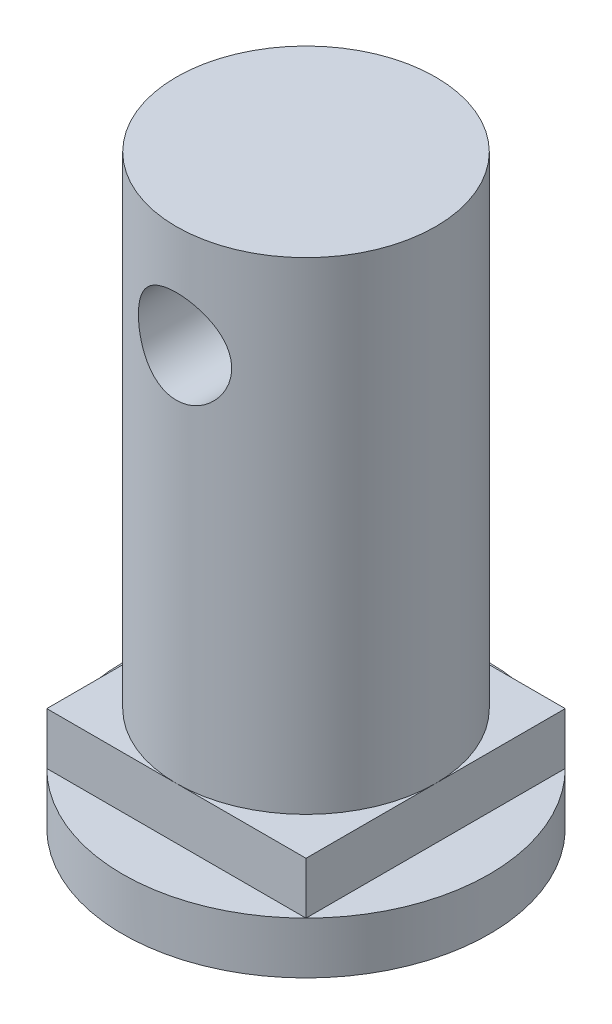
ISO-10303-21;
HEADER;
FILE_DESCRIPTION(('STEP AP214'),'2;1');
FILE_NAME('part.step','',(''),(''),'','','');
FILE_SCHEMA(('AUTOMOTIVE_DESIGN { 1 0 10303 214 1 1 1 1 }'));
ENDSEC;
DATA;
#1=APPLICATION_CONTEXT('core data for automotive mechanical design processes');
#2=APPLICATION_PROTOCOL_DEFINITION('international standard','automotive_design',2000,#1);
#3=PRODUCT_CONTEXT('',#1,'mechanical');
#4=PRODUCT('Part','Part','',(#3));
#5=PRODUCT_RELATED_PRODUCT_CATEGORY('part','',(#4));
#6=PRODUCT_DEFINITION_FORMATION('','',#4);
#7=PRODUCT_DEFINITION_CONTEXT('part definition',#1,'design');
#8=PRODUCT_DEFINITION('design','',#6,#7);
#9=PRODUCT_DEFINITION_SHAPE('','',#8);
#10=(LENGTH_UNIT() NAMED_UNIT(*) SI_UNIT(.MILLI.,.METRE.));
#11=(NAMED_UNIT(*) PLANE_ANGLE_UNIT() SI_UNIT($,.RADIAN.));
#12=(NAMED_UNIT(*) SI_UNIT($,.STERADIAN.) SOLID_ANGLE_UNIT());
#13=UNCERTAINTY_MEASURE_WITH_UNIT(LENGTH_MEASURE(1.E-05),#10,'distance_accuracy_value','');
#14=(GEOMETRIC_REPRESENTATION_CONTEXT(3) GLOBAL_UNCERTAINTY_ASSIGNED_CONTEXT((#13)) GLOBAL_UNIT_ASSIGNED_CONTEXT((#10,
#11,#12)) REPRESENTATION_CONTEXT('',''));
#15=CARTESIAN_POINT('',(0.,0.,0.));
#16=DIRECTION('',(0.,0.,1.));
#17=DIRECTION('',(1.,0.,0.));
#18=AXIS2_PLACEMENT_3D('',#15,#16,#17);
#19=CARTESIAN_POINT('',(0.,1.,0.));
#20=DIRECTION('',(0.,-1.,0.));
#21=DIRECTION('',(0.,0.,-1.));
#22=AXIS2_PLACEMENT_3D('',#19,#20,#21);
#23=PLANE('',#22);
#24=CARTESIAN_POINT('',(2.5,1.,-2.5));
#25=DIRECTION('',(0.,1.,0.));
#26=DIRECTION('',(0.,0.,1.));
#27=AXIS2_PLACEMENT_3D('',#24,#25,#26);
#28=CIRCLE('',#27,2.5);
#29=CARTESIAN_POINT('',(2.5,1.,0.));
#30=VERTEX_POINT('',#29);
#31=CARTESIAN_POINT('',(5.,1.,-2.5));
#32=VERTEX_POINT('',#31);
#33=EDGE_CURVE('E57',#30,#32,#28,.T.);
#34=ORIENTED_EDGE('',*,*,#33,.F.);
#35=DIRECTION('',(1.,0.,0.));
#36=VECTOR('',#35,1.);
#37=CARTESIAN_POINT('',(0.,1.,0.));
#38=LINE('',#37,#36);
#39=CARTESIAN_POINT('',(5.,1.,0.));
#40=VERTEX_POINT('',#39);
#41=EDGE_CURVE('E112',#30,#40,#38,.T.);
#42=ORIENTED_EDGE('',*,*,#41,.T.);
#43=DIRECTION('',(0.,0.,-1.));
#44=VECTOR('',#43,1.);
#45=CARTESIAN_POINT('',(5.,1.,0.));
#46=LINE('',#45,#44);
#47=EDGE_CURVE('E126',#40,#32,#46,.T.);
#48=ORIENTED_EDGE('',*,*,#47,.T.);
#49=EDGE_LOOP('',(#34,#42,#48));
#50=FACE_BOUND('',#49,.T.);
#51=ADVANCED_FACE('F45',(#50),#23,.F.);
#52=CARTESIAN_POINT('',(2.5,1.,-5.));
#53=VERTEX_POINT('',#52);
#54=EDGE_CURVE('E11',#32,#53,#28,.T.);
#55=ORIENTED_EDGE('',*,*,#54,.F.);
#56=CARTESIAN_POINT('',(5.,1.,-5.));
#57=VERTEX_POINT('',#56);
#58=EDGE_CURVE('E111',#32,#57,#46,.T.);
#59=ORIENTED_EDGE('',*,*,#58,.T.);
#60=DIRECTION('',(-1.,0.,0.));
#61=VECTOR('',#60,1.);
#62=CARTESIAN_POINT('',(0.,1.,-5.));
#63=LINE('',#62,#61);
#64=EDGE_CURVE('E154',#57,#53,#63,.T.);
#65=ORIENTED_EDGE('',*,*,#64,.T.);
#66=EDGE_LOOP('',(#55,#59,#65));
#67=FACE_BOUND('',#66,.T.);
#68=ADVANCED_FACE('F242',(#67),#23,.F.);
#69=CARTESIAN_POINT('',(0.,1.,-2.5));
#70=VERTEX_POINT('',#69);
#71=EDGE_CURVE('E55',#53,#70,#28,.T.);
#72=ORIENTED_EDGE('',*,*,#71,.F.);
#73=CARTESIAN_POINT('',(0.,1.,-5.));
#74=VERTEX_POINT('',#73);
#75=EDGE_CURVE('E153',#53,#74,#63,.T.);
#76=ORIENTED_EDGE('',*,*,#75,.T.);
#77=DIRECTION('',(0.,0.,1.));
#78=VECTOR('',#77,1.);
#79=CARTESIAN_POINT('',(0.,1.,0.));
#80=LINE('',#79,#78);
#81=EDGE_CURVE('E124',#74,#70,#80,.T.);
#82=ORIENTED_EDGE('',*,*,#81,.T.);
#83=EDGE_LOOP('',(#72,#76,#82));
#84=FACE_BOUND('',#83,.T.);
#85=ADVANCED_FACE('F232',(#84),#23,.F.);
#86=CARTESIAN_POINT('',(0.,1.,0.));
#87=DIRECTION('',(1.,0.,0.));
#88=DIRECTION('',(0.,0.,-1.));
#89=AXIS2_PLACEMENT_3D('',#86,#87,#88);
#90=PLANE('',#89);
#91=DIRECTION('',(0.,0.,1.));
#92=VECTOR('',#91,1.);
#93=CARTESIAN_POINT('',(0.,0.,0.));
#94=LINE('',#93,#92);
#95=CARTESIAN_POINT('',(0.,0.,-5.));
#96=VERTEX_POINT('',#95);
#97=CARTESIAN_POINT('',(0.,0.,0.));
#98=VERTEX_POINT('',#97);
#99=EDGE_CURVE('E143',#96,#98,#94,.T.);
#100=ORIENTED_EDGE('',*,*,#99,.T.);
#101=DIRECTION('',(0.,-1.,0.));
#102=VECTOR('',#101,1.);
#103=CARTESIAN_POINT('',(0.,1.,0.));
#104=LINE('',#103,#102);
#105=CARTESIAN_POINT('',(0.,1.,0.));
#106=VERTEX_POINT('',#105);
#107=EDGE_CURVE('E49',#106,#98,#104,.T.);
#108=ORIENTED_EDGE('',*,*,#107,.F.);
#109=EDGE_CURVE('E106',#70,#106,#80,.T.);
#110=ORIENTED_EDGE('',*,*,#109,.F.);
#111=ORIENTED_EDGE('',*,*,#81,.F.);
#112=DIRECTION('',(0.,-1.,0.));
#113=VECTOR('',#112,1.);
#114=CARTESIAN_POINT('',(0.,1.,-5.));
#115=LINE('',#114,#113);
#116=EDGE_CURVE('E157',#74,#96,#115,.T.);
#117=ORIENTED_EDGE('',*,*,#116,.T.);
#118=EDGE_LOOP('',(#100,#108,#110,#111,#117));
#119=FACE_BOUND('',#118,.T.);
#120=ADVANCED_FACE('F47',(#119),#90,.F.);
#121=CARTESIAN_POINT('',(0.,1.,0.));
#122=DIRECTION('',(0.,0.,-1.));
#123=DIRECTION('',(-1.,0.,0.));
#124=AXIS2_PLACEMENT_3D('',#121,#122,#123);
#125=PLANE('',#124);
#126=DIRECTION('',(1.,0.,0.));
#127=VECTOR('',#126,1.);
#128=CARTESIAN_POINT('',(0.,0.,0.));
#129=LINE('',#128,#127);
#130=CARTESIAN_POINT('',(5.,0.,0.));
#131=VERTEX_POINT('',#130);
#132=EDGE_CURVE('E161',#98,#131,#129,.T.);
#133=ORIENTED_EDGE('',*,*,#132,.T.);
#134=DIRECTION('',(0.,-1.,0.));
#135=VECTOR('',#134,1.);
#136=CARTESIAN_POINT('',(5.,1.,0.));
#137=LINE('',#136,#135);
#138=EDGE_CURVE('E119',#40,#131,#137,.T.);
#139=ORIENTED_EDGE('',*,*,#138,.F.);
#140=ORIENTED_EDGE('',*,*,#41,.F.);
#141=EDGE_CURVE('E100',#106,#30,#38,.T.);
#142=ORIENTED_EDGE('',*,*,#141,.F.);
#143=ORIENTED_EDGE('',*,*,#107,.T.);
#144=EDGE_LOOP('',(#133,#139,#140,#142,#143));
#145=FACE_BOUND('',#144,.T.);
#146=ADVANCED_FACE('F117',(#145),#125,.F.);
#147=CARTESIAN_POINT('',(5.,1.,0.));
#148=DIRECTION('',(-1.,0.,0.));
#149=DIRECTION('',(0.,0.,1.));
#150=AXIS2_PLACEMENT_3D('',#147,#148,#149);
#151=PLANE('',#150);
#152=DIRECTION('',(0.,0.,-1.));
#153=VECTOR('',#152,1.);
#154=CARTESIAN_POINT('',(5.,0.,0.));
#155=LINE('',#154,#153);
#156=CARTESIAN_POINT('',(5.,0.,-5.));
#157=VERTEX_POINT('',#156);
#158=EDGE_CURVE('E164',#131,#157,#155,.T.);
#159=ORIENTED_EDGE('',*,*,#158,.T.);
#160=DIRECTION('',(0.,-1.,0.));
#161=VECTOR('',#160,1.);
#162=CARTESIAN_POINT('',(5.,1.,-5.));
#163=LINE('',#162,#161);
#164=EDGE_CURVE('E175',#57,#157,#163,.T.);
#165=ORIENTED_EDGE('',*,*,#164,.F.);
#166=ORIENTED_EDGE('',*,*,#58,.F.);
#167=ORIENTED_EDGE('',*,*,#47,.F.);
#168=ORIENTED_EDGE('',*,*,#138,.T.);
#169=EDGE_LOOP('',(#159,#165,#166,#167,#168));
#170=FACE_BOUND('',#169,.T.);
#171=ADVANCED_FACE('F179',(#170),#151,.F.);
#172=CARTESIAN_POINT('',(0.,1.,-5.));
#173=DIRECTION('',(0.,0.,1.));
#174=DIRECTION('',(1.,0.,0.));
#175=AXIS2_PLACEMENT_3D('',#172,#173,#174);
#176=PLANE('',#175);
#177=DIRECTION('',(-1.,0.,0.));
#178=VECTOR('',#177,1.);
#179=CARTESIAN_POINT('',(0.,0.,-5.));
#180=LINE('',#179,#178);
#181=EDGE_CURVE('E168',#157,#96,#180,.T.);
#182=ORIENTED_EDGE('',*,*,#181,.T.);
#183=ORIENTED_EDGE('',*,*,#116,.F.);
#184=ORIENTED_EDGE('',*,*,#75,.F.);
#185=ORIENTED_EDGE('',*,*,#64,.F.);
#186=ORIENTED_EDGE('',*,*,#164,.T.);
#187=EDGE_LOOP('',(#182,#183,#184,#185,#186));
#188=FACE_BOUND('',#187,.T.);
#189=ADVANCED_FACE('F231',(#188),#176,.F.);
#190=EDGE_CURVE('E104',#70,#30,#28,.T.);
#191=ORIENTED_EDGE('',*,*,#190,.F.);
#192=ORIENTED_EDGE('',*,*,#109,.T.);
#193=ORIENTED_EDGE('',*,*,#141,.T.);
#194=EDGE_LOOP('',(#191,#192,#193));
#195=FACE_BOUND('',#194,.T.);
#196=ADVANCED_FACE('F102',(#195),#23,.F.);
#197=CARTESIAN_POINT('',(2.5,0.,-2.5));
#198=DIRECTION('',(0.,-1.,0.));
#199=DIRECTION('',(0.,0.,-1.));
#200=AXIS2_PLACEMENT_3D('',#197,#198,#199);
#201=PLANE('',#200);
#202=ORIENTED_EDGE('',*,*,#99,.F.);
#203=CARTESIAN_POINT('',(2.5,0.,-2.5));
#204=DIRECTION('',(0.,-1.,0.));
#205=DIRECTION('',(0.,0.,-1.));
#206=AXIS2_PLACEMENT_3D('',#203,#204,#205);
#207=CIRCLE('',#206,3.53553390593274);
#208=EDGE_CURVE('E345',#98,#96,#207,.T.);
#209=ORIENTED_EDGE('',*,*,#208,.F.);
#210=EDGE_LOOP('',(#202,#209));
#211=FACE_BOUND('',#210,.T.);
#212=ADVANCED_FACE('F220',(#211),#201,.F.);
#213=ORIENTED_EDGE('',*,*,#181,.F.);
#214=EDGE_CURVE('E148',#96,#157,#207,.T.);
#215=ORIENTED_EDGE('',*,*,#214,.F.);
#216=EDGE_LOOP('',(#213,#215));
#217=FACE_BOUND('',#216,.T.);
#218=ADVANCED_FACE('F223',(#217),#201,.F.);
#219=ORIENTED_EDGE('',*,*,#158,.F.);
#220=EDGE_CURVE('E144',#157,#131,#207,.T.);
#221=ORIENTED_EDGE('',*,*,#220,.F.);
#222=EDGE_LOOP('',(#219,#221));
#223=FACE_BOUND('',#222,.T.);
#224=ADVANCED_FACE('F300',(#223),#201,.F.);
#225=ORIENTED_EDGE('',*,*,#132,.F.);
#226=EDGE_CURVE('E147',#131,#98,#207,.T.);
#227=ORIENTED_EDGE('',*,*,#226,.F.);
#228=EDGE_LOOP('',(#225,#227));
#229=FACE_BOUND('',#228,.T.);
#230=ADVANCED_FACE('F225',(#229),#201,.F.);
#231=CARTESIAN_POINT('',(2.5,-1.,-2.5));
#232=DIRECTION('',(0.,1.,0.));
#233=DIRECTION('',(0.,0.,1.));
#234=AXIS2_PLACEMENT_3D('',#231,#232,#233);
#235=CYLINDRICAL_SURFACE('',#234,3.53553390593274);
#236=CARTESIAN_POINT('',(2.5,-1.,-2.5));
#237=DIRECTION('',(0.,-1.,0.));
#238=DIRECTION('',(0.,0.,-1.));
#239=AXIS2_PLACEMENT_3D('',#236,#237,#238);
#240=CIRCLE('',#239,3.53553390593274);
#241=CARTESIAN_POINT('',(2.5,-1.,-6.03553390593274));
#242=VERTEX_POINT('',#241);
#243=EDGE_CURVE('E139',#242,#242,#240,.T.);
#244=ORIENTED_EDGE('',*,*,#243,.F.);
#245=EDGE_LOOP('',(#244));
#246=FACE_BOUND('',#245,.T.);
#247=ORIENTED_EDGE('',*,*,#220,.T.);
#248=ORIENTED_EDGE('',*,*,#226,.T.);
#249=ORIENTED_EDGE('',*,*,#208,.T.);
#250=ORIENTED_EDGE('',*,*,#214,.T.);
#251=EDGE_LOOP('',(#247,#248,#249,#250));
#252=FACE_BOUND('',#251,.T.);
#253=ADVANCED_FACE('F218',(#246,#252),#235,.T.);
#254=CARTESIAN_POINT('',(2.5,-1.,-2.5));
#255=DIRECTION('',(0.,-1.,0.));
#256=DIRECTION('',(0.,0.,-1.));
#257=AXIS2_PLACEMENT_3D('',#254,#255,#256);
#258=PLANE('',#257);
#259=ORIENTED_EDGE('',*,*,#243,.T.);
#260=EDGE_LOOP('',(#259));
#261=FACE_BOUND('',#260,.T.);
#262=ADVANCED_FACE('F214',(#261),#258,.T.);
#263=CARTESIAN_POINT('',(2.5,10.3,-2.5));
#264=DIRECTION('',(0.,-1.,0.));
#265=DIRECTION('',(0.,0.,-1.));
#266=AXIS2_PLACEMENT_3D('',#263,#264,#265);
#267=CYLINDRICAL_SURFACE('',#266,2.5);
#268=CARTESIAN_POINT('',(1.6,8.29999999999999,-4.83238075793812));
#269=CARTESIAN_POINT('',(1.5999988310946,8.34876077261855,-4.83237972255872));
#270=CARTESIAN_POINT('',(1.60397595979654,8.3975135116308,-4.83392649973988));
#271=CARTESIAN_POINT('',(1.61971407383427,8.49355847846579,-4.83990735648669));
#272=CARTESIAN_POINT('',(1.63147534085306,8.54085065337058,-4.84434154053824));
#273=CARTESIAN_POINT('',(1.66230195401386,8.63256375653346,-4.85553123375878));
#274=CARTESIAN_POINT('',(1.68135101404703,8.67699083061935,-4.86228156356725));
#275=CARTESIAN_POINT('',(1.7261554741314,8.76203504239918,-4.87733492032442));
#276=CARTESIAN_POINT('',(1.75191270787681,8.8026511342168,-4.88563837164716));
#277=CARTESIAN_POINT('',(1.81066419873866,8.88077805066752,-4.90328804585983));
#278=CARTESIAN_POINT('',(1.84391476837038,8.91808962801866,-4.91266326645175));
#279=CARTESIAN_POINT('',(1.91616405909194,8.9867457968939,-4.93115707345925));
#280=CARTESIAN_POINT('',(1.95516388418706,9.01808923972732,-4.94027561018351));
#281=CARTESIAN_POINT('',(2.03929635057485,9.07485821370753,-4.95756996869939));
#282=CARTESIAN_POINT('',(2.08458167308578,9.10007007806623,-4.96570778605709));
#283=CARTESIAN_POINT('',(2.17909501593966,9.14243653780125,-4.97977783065992));
#284=CARTESIAN_POINT('',(2.22832177796883,9.15959369275132,-4.98571075843563));
#285=CARTESIAN_POINT('',(2.32722795157567,9.18467357711901,-4.9944968780727));
#286=CARTESIAN_POINT('',(2.37681023466333,9.19293869672343,-4.9974639206395));
#287=CARTESIAN_POINT('',(2.47674086194507,9.20109383356248,-5.000390891219));
#288=CARTESIAN_POINT('',(2.52708897191783,9.20098636195888,-5.00035172087459));
#289=CARTESIAN_POINT('',(2.62467942063577,9.19260540830949,-4.99734487377734));
#290=CARTESIAN_POINT('',(2.67195861486997,9.18470493632491,-4.99451096773935));
#291=CARTESIAN_POINT('',(2.76446879699774,9.16158573657739,-4.98640572646177));
#292=CARTESIAN_POINT('',(2.80969964124737,9.14636649644059,-4.98113422057116));
#293=CARTESIAN_POINT('',(2.8975845014312,9.10885240497586,-4.96858795160326));
#294=CARTESIAN_POINT('',(2.94019313126167,9.08646070894368,-4.96128596151781));
#295=CARTESIAN_POINT('',(3.02115046019317,9.03532064859256,-4.94542561558651));
#296=CARTESIAN_POINT('',(3.05949784295766,9.00657032819492,-4.93686687340382));
#297=CARTESIAN_POINT('',(3.13305081808628,8.94170055370001,-4.9188340861146));
#298=CARTESIAN_POINT('',(3.1679726347311,8.90526566196564,-4.90933557563966));
#299=CARTESIAN_POINT('',(3.23131191430383,8.82698994126879,-4.89087303983219));
#300=CARTESIAN_POINT('',(3.25972799716505,8.78514796823723,-4.88190912820223));
#301=CARTESIAN_POINT('',(3.30973374403535,8.69620934659499,-4.8653838047668));
#302=CARTESIAN_POINT('',(3.33118310191462,8.64902780384452,-4.85785235271216));
#303=CARTESIAN_POINT('',(3.3657286738907,8.55138074727576,-4.84539019167064));
#304=CARTESIAN_POINT('',(3.37882910075839,8.5009169038567,-4.84045817125928));
#305=CARTESIAN_POINT('',(3.39568486162895,8.40092305065069,-4.83405788543153));
#306=CARTESIAN_POINT('',(3.39988714987818,8.35147901933812,-4.83242415952583));
#307=CARTESIAN_POINT('',(3.40010828267304,8.25257602020313,-4.83233911876553));
#308=CARTESIAN_POINT('',(3.39612895029201,8.20311705816301,-4.83388709494669));
#309=CARTESIAN_POINT('',(3.38050383939668,8.10778065171387,-4.83982409955253));
#310=CARTESIAN_POINT('',(3.36919009750261,8.06184025296223,-4.84408994930444));
#311=CARTESIAN_POINT('',(3.33962781249617,7.97252616343864,-4.8548398599736));
#312=CARTESIAN_POINT('',(3.3213779172127,7.92915297503913,-4.86132435338058));
#313=CARTESIAN_POINT('',(3.27772991525145,7.8444954488123,-4.87606465692084));
#314=CARTESIAN_POINT('',(3.25210116704368,7.80333981981316,-4.88437514971294));
#315=CARTESIAN_POINT('',(3.19467413351478,7.72575344722467,-4.90173404552875));
#316=CARTESIAN_POINT('',(3.16287374772465,7.6893243193264,-4.91078269917029));
#317=CARTESIAN_POINT('',(3.09183639463389,7.62005177853221,-4.92922829134542));
#318=CARTESIAN_POINT('',(3.0522766447546,7.58753564535454,-4.93861528058005));
#319=CARTESIAN_POINT('',(2.96803055910256,7.52957082853051,-4.956175134738));
#320=CARTESIAN_POINT('',(2.92334429450827,7.50412204677516,-4.96434801651484));
#321=CARTESIAN_POINT('',(2.83022668939111,7.46121259084982,-4.97853887788453));
#322=CARTESIAN_POINT('',(2.78181474932663,7.44371342914428,-4.98456720869391));
#323=CARTESIAN_POINT('',(2.68247046637583,7.41719507218553,-4.9938300477662));
#324=CARTESIAN_POINT('',(2.63153921388232,7.40817224148666,-4.9970657537201));
#325=CARTESIAN_POINT('',(2.53157259053393,7.39923125632131,-5.00027374444055));
#326=CARTESIAN_POINT('',(2.48258391806748,7.39884649879399,-5.00041327063264));
#327=CARTESIAN_POINT('',(2.38527151462321,7.40601066191544,-4.99784020568471));
#328=CARTESIAN_POINT('',(2.33694771430426,7.41355874877636,-4.99512791428722));
#329=CARTESIAN_POINT('',(2.24336315907649,7.43605214410726,-4.98722714248642));
#330=CARTESIAN_POINT('',(2.19805934102281,7.45083840821812,-4.98209198374571));
#331=CARTESIAN_POINT('',(2.11056622872084,7.48723457844824,-4.9698774626675));
#332=CARTESIAN_POINT('',(2.06837752138439,7.50884576641096,-4.96279773513759));
#333=CARTESIAN_POINT('',(1.98644917626604,7.55927595196162,-4.94705463029599));
#334=CARTESIAN_POINT('',(1.94687726804129,7.58835080540135,-4.93833884114341));
#335=CARTESIAN_POINT('',(1.87302650867719,7.65246822620577,-4.9204030644955));
#336=CARTESIAN_POINT('',(1.83874948800668,7.68751284858444,-4.91118290412151));
#337=CARTESIAN_POINT('',(1.77478774308687,7.76456454065739,-4.89274502411565));
#338=CARTESIAN_POINT('',(1.74539963636384,7.80682378654405,-4.88354835176278));
#339=CARTESIAN_POINT('',(1.69414347551836,7.8959726131574,-4.86671209373524));
#340=CARTESIAN_POINT('',(1.67227510793206,7.94286200076955,-4.85907244316078));
#341=CARTESIAN_POINT('',(1.63663496275692,8.04052215536305,-4.84626654175687));
#342=CARTESIAN_POINT('',(1.62294915462848,8.0913280128433,-4.84112665579182));
#343=CARTESIAN_POINT('',(1.60463467943077,8.19475967783668,-4.83418519806388));
#344=CARTESIAN_POINT('',(1.60000126131151,8.24738451590933,-4.83238187516793));
#345=CARTESIAN_POINT('',(1.6,8.29999999999999,-4.83238075793812));
#346=B_SPLINE_CURVE_WITH_KNOTS('',3,(#268,#269,#270,#271,#272,#273,#274,#275,#276,#277,#278,
#279,#280,#281,#282,#283,#284,#285,#286,#287,#288,#289,#290,#291,#292,#293,#294,#295,#296,#297,
#298,#299,#300,#301,#302,#303,#304,#305,#306,#307,#308,#309,#310,#311,#312,#313,#314,#315,#316,
#317,#318,#319,#320,#321,#322,#323,#324,#325,#326,#327,#328,#329,#330,#331,#332,#333,#334,#335,
#336,#337,#338,#339,#340,#341,#342,#343,#344,#345),.UNSPECIFIED.,.T.,.F.,(4,2,2,2,2,2,2,2,2,2,2,
2,2,2,2,2,2,2,2,2,2,2,2,2,2,2,2,2,2,2,2,2,2,2,2,2,2,2,4),(0.,0.146086790422655,
0.292178867546775,0.437946360320959,0.583753740861977,0.735621751211313,0.887518962213253,
1.04412673491154,1.20068470805653,1.35097110894591,1.50121243513853,1.64459510288818,
1.78798781006364,1.93340460520995,2.07886619673078,2.23222853504487,2.38562337615772,
2.54193943054282,2.69817654713301,2.84635909673995,2.9945086310812,3.136379856629,
3.2782787535153,3.42521213872044,3.57219561953956,3.72764307152483,3.88308836548029,
4.03777284455019,4.19239095007947,4.33863569017373,4.48486506063665,4.62801652521723,
4.7711948922236,4.92015591571603,5.06916832107719,5.22528055804461,5.38138628661105,
5.53910455331926,5.69674002102334),.UNSPECIFIED.);
#347=CARTESIAN_POINT('',(1.6,8.29999999999999,-4.83238075793812));
#348=VERTEX_POINT('',#347);
#349=EDGE_CURVE('E186',#348,#348,#346,.T.);
#350=ORIENTED_EDGE('',*,*,#349,.F.);
#351=EDGE_LOOP('',(#350));
#352=FACE_BOUND('',#351,.T.);
#353=CARTESIAN_POINT('',(1.6,8.29999999999999,-0.167619242061877));
#354=CARTESIAN_POINT('',(1.5999988310946,8.25123922738143,-0.167620277441282));
#355=CARTESIAN_POINT('',(1.60397595979654,8.20248648836918,-0.166073500260116));
#356=CARTESIAN_POINT('',(1.61971407383427,8.10644152153419,-0.160092643513306));
#357=CARTESIAN_POINT('',(1.63147534085306,8.0591493466294,-0.155658459461761));
#358=CARTESIAN_POINT('',(1.66230195401386,7.96743624346652,-0.144468766241218));
#359=CARTESIAN_POINT('',(1.68135101404703,7.92300916938063,-0.137718436432745));
#360=CARTESIAN_POINT('',(1.7261554741314,7.8379649576008,-0.122665079675584));
#361=CARTESIAN_POINT('',(1.75191270787681,7.79734886578318,-0.114361628352838));
#362=CARTESIAN_POINT('',(1.81066419873866,7.71922194933246,-0.0967119541401698));
#363=CARTESIAN_POINT('',(1.84391476837038,7.68191037198132,-0.08733673354825));
#364=CARTESIAN_POINT('',(1.91616405909194,7.61325420310607,-0.0688429265407449));
#365=CARTESIAN_POINT('',(1.95516388418706,7.58191076027265,-0.0597243898164905));
#366=CARTESIAN_POINT('',(2.03929635057485,7.52514178629245,-0.0424300313006107));
#367=CARTESIAN_POINT('',(2.08458167308578,7.49992992193374,-0.0342922139429125));
#368=CARTESIAN_POINT('',(2.17909501593966,7.45756346219873,-0.0202221693400807));
#369=CARTESIAN_POINT('',(2.22832177796883,7.44040630724865,-0.0142892415643646));
#370=CARTESIAN_POINT('',(2.32722795157567,7.41532642288097,-0.00550312192730348));
#371=CARTESIAN_POINT('',(2.37681023466333,7.40706130327655,-0.00253607936050109));
#372=CARTESIAN_POINT('',(2.47674086194507,7.3989061664375,0.000390891218998416));
#373=CARTESIAN_POINT('',(2.52708897191783,7.3990136380411,0.000351720874587429));
#374=CARTESIAN_POINT('',(2.62467942063577,7.40739459169049,-0.00265512622265858));
#375=CARTESIAN_POINT('',(2.67195861486997,7.41529506367507,-0.00548903226064793));
#376=CARTESIAN_POINT('',(2.76446879699774,7.43841426342258,-0.0135942735382323));
#377=CARTESIAN_POINT('',(2.80969964124737,7.45363350355939,-0.0188657794288406));
#378=CARTESIAN_POINT('',(2.8975845014312,7.49114759502412,-0.031412048396743));
#379=CARTESIAN_POINT('',(2.94019313126167,7.51353929105629,-0.0387140384821908));
#380=CARTESIAN_POINT('',(3.02115046019317,7.56467935140742,-0.0545743844134872));
#381=CARTESIAN_POINT('',(3.05949784295766,7.59342967180506,-0.0631331265961785));
#382=CARTESIAN_POINT('',(3.13305081808628,7.65829944629997,-0.0811659138853987));
#383=CARTESIAN_POINT('',(3.1679726347311,7.69473433803434,-0.0906644243603361));
#384=CARTESIAN_POINT('',(3.23131191430383,7.77301005873119,-0.109126960167812));
#385=CARTESIAN_POINT('',(3.25972799716505,7.81485203176275,-0.118090871797772));
#386=CARTESIAN_POINT('',(3.30973374403535,7.90379065340498,-0.134616195233197));
#387=CARTESIAN_POINT('',(3.33118310191462,7.95097219615546,-0.142147647287835));
#388=CARTESIAN_POINT('',(3.3657286738907,8.04861925272421,-0.154609808329362));
#389=CARTESIAN_POINT('',(3.37882910075839,8.09908309614327,-0.159541828740722));
#390=CARTESIAN_POINT('',(3.39568486162895,8.19907694934928,-0.165942114568465));
#391=CARTESIAN_POINT('',(3.39988714987818,8.24852098066186,-0.167575840474173));
#392=CARTESIAN_POINT('',(3.40010828267304,8.34742397979685,-0.167660881234472));
#393=CARTESIAN_POINT('',(3.39612895029201,8.39688294183697,-0.166112905053306));
#394=CARTESIAN_POINT('',(3.38050383939668,8.49221934828611,-0.16017590044747));
#395=CARTESIAN_POINT('',(3.36919009750261,8.53815974703775,-0.155910050695561));
#396=CARTESIAN_POINT('',(3.33962781249617,8.62747383656134,-0.145160140026402));
#397=CARTESIAN_POINT('',(3.3213779172127,8.67084702496085,-0.138675646619417));
#398=CARTESIAN_POINT('',(3.27772991525145,8.75550455118768,-0.12393534307916));
#399=CARTESIAN_POINT('',(3.25210116704368,8.79666018018682,-0.115624850287064));
#400=CARTESIAN_POINT('',(3.19467413351478,8.8742465527753,-0.0982659544712512));
#401=CARTESIAN_POINT('',(3.16287374772465,8.91067568067357,-0.089217300829707));
#402=CARTESIAN_POINT('',(3.09183639463389,8.97994822146777,-0.0707717086545786));
#403=CARTESIAN_POINT('',(3.0522766447546,9.01246435464543,-0.0613847194199514));
#404=CARTESIAN_POINT('',(2.96803055910257,9.07042917146946,-0.043824865261996));
#405=CARTESIAN_POINT('',(2.92334429450828,9.09587795322482,-0.0356519834851574));
#406=CARTESIAN_POINT('',(2.83022668939111,9.13878740915016,-0.0214611221154698));
#407=CARTESIAN_POINT('',(2.78181474932663,9.1562865708557,-0.01543279130609));
#408=CARTESIAN_POINT('',(2.68247046637583,9.18280492781444,-0.00616995223379688));
#409=CARTESIAN_POINT('',(2.63153921388231,9.19182775851331,-0.00293424627989819));
#410=CARTESIAN_POINT('',(2.53157259053393,9.20076874367866,0.000273744440549313));
#411=CARTESIAN_POINT('',(2.48258391806748,9.20115350120598,0.000413270632638444));
#412=CARTESIAN_POINT('',(2.38527151462321,9.19398933808453,-0.00215979431528546));
#413=CARTESIAN_POINT('',(2.33694771430426,9.18644125122362,-0.00487208571278092));
#414=CARTESIAN_POINT('',(2.24336315907649,9.16394785589272,-0.0127728575135761));
#415=CARTESIAN_POINT('',(2.19805934102281,9.14916159178185,-0.0179080162542938));
#416=CARTESIAN_POINT('',(2.11056622872084,9.11276542155173,-0.0301225373324973));
#417=CARTESIAN_POINT('',(2.06837752138439,9.09115423358902,-0.0372022648624104));
#418=CARTESIAN_POINT('',(1.98644917626604,9.04072404803836,-0.052945369704009));
#419=CARTESIAN_POINT('',(1.94687726804129,9.01164919459862,-0.0616611588565855));
#420=CARTESIAN_POINT('',(1.87302650867719,8.94753177379421,-0.0795969355045019));
#421=CARTESIAN_POINT('',(1.83874948800668,8.91248715141553,-0.0888170958784849));
#422=CARTESIAN_POINT('',(1.77478774308687,8.83543545934258,-0.107254975884353));
#423=CARTESIAN_POINT('',(1.74539963636384,8.79317621345592,-0.116451648237217));
#424=CARTESIAN_POINT('',(1.69414347551836,8.70402738684258,-0.13328790626476));
#425=CARTESIAN_POINT('',(1.67227510793206,8.65713799923043,-0.140927556839215));
#426=CARTESIAN_POINT('',(1.63663496275692,8.55947784463692,-0.153733458243132));
#427=CARTESIAN_POINT('',(1.62294915462848,8.50867198715667,-0.158873344208182));
#428=CARTESIAN_POINT('',(1.60463467943077,8.4052403221633,-0.165814801936119));
#429=CARTESIAN_POINT('',(1.60000126131151,8.35261548409065,-0.16761812483207));
#430=CARTESIAN_POINT('',(1.6,8.29999999999999,-0.167619242061877));
#431=B_SPLINE_CURVE_WITH_KNOTS('',3,(#353,#354,#355,#356,#357,#358,#359,#360,#361,#362,#363,
#364,#365,#366,#367,#368,#369,#370,#371,#372,#373,#374,#375,#376,#377,#378,#379,#380,#381,#382,
#383,#384,#385,#386,#387,#388,#389,#390,#391,#392,#393,#394,#395,#396,#397,#398,#399,#400,#401,
#402,#403,#404,#405,#406,#407,#408,#409,#410,#411,#412,#413,#414,#415,#416,#417,#418,#419,#420,
#421,#422,#423,#424,#425,#426,#427,#428,#429,#430),.UNSPECIFIED.,.T.,.F.,(4,2,2,2,2,2,2,2,2,2,2,
2,2,2,2,2,2,2,2,2,2,2,2,2,2,2,2,2,2,2,2,2,2,2,2,2,2,2,4),(0.,0.146086790422655,
0.292178867546775,0.437946360320958,0.583753740861976,0.735621751211314,0.887518962213254,
1.04412673491154,1.20068470805653,1.35097110894591,1.50121243513853,1.64459510288818,
1.78798781006364,1.93340460520995,2.07886619673078,2.23222853504487,2.38562337615772,
2.54193943054282,2.69817654713301,2.84635909673995,2.9945086310812,3.136379856629,
3.2782787535153,3.42521213872044,3.57219561953956,3.72764307152483,3.88308836548029,
4.0377728445502,4.19239095007947,4.33863569017373,4.48486506063665,4.62801652521723,
4.7711948922236,4.92015591571603,5.06916832107719,5.22528055804461,5.38138628661105,
5.53910455331927,5.69674002102334),.UNSPECIFIED.);
#432=CARTESIAN_POINT('',(1.6,8.29999999999999,-0.167619242061877));
#433=VERTEX_POINT('',#432);
#434=EDGE_CURVE('E130',#433,#433,#431,.T.);
#435=ORIENTED_EDGE('',*,*,#434,.F.);
#436=EDGE_LOOP('',(#435));
#437=FACE_BOUND('',#436,.T.);
#438=CARTESIAN_POINT('',(2.5,10.3,-2.5));
#439=DIRECTION('',(0.,1.,0.));
#440=DIRECTION('',(0.,0.,1.));
#441=AXIS2_PLACEMENT_3D('',#438,#439,#440);
#442=CIRCLE('',#441,2.5);
#443=CARTESIAN_POINT('',(2.5,10.3,0.));
#444=VERTEX_POINT('',#443);
#445=EDGE_CURVE('E129',#444,#444,#442,.T.);
#446=ORIENTED_EDGE('',*,*,#445,.F.);
#447=EDGE_LOOP('',(#446));
#448=FACE_BOUND('',#447,.T.);
#449=ORIENTED_EDGE('',*,*,#33,.T.);
#450=ORIENTED_EDGE('',*,*,#54,.T.);
#451=ORIENTED_EDGE('',*,*,#71,.T.);
#452=ORIENTED_EDGE('',*,*,#190,.T.);
#453=EDGE_LOOP('',(#449,#450,#451,#452));
#454=FACE_BOUND('',#453,.T.);
#455=ADVANCED_FACE('F131',(#352,#437,#448,#454),#267,.T.);
#456=CARTESIAN_POINT('',(2.5,10.3,-2.5));
#457=DIRECTION('',(0.,1.,0.));
#458=DIRECTION('',(0.,0.,1.));
#459=AXIS2_PLACEMENT_3D('',#456,#457,#458);
#460=PLANE('',#459);
#461=ORIENTED_EDGE('',*,*,#445,.T.);
#462=EDGE_LOOP('',(#461));
#463=FACE_BOUND('',#462,.T.);
#464=ADVANCED_FACE('F206',(#463),#460,.T.);
#465=CARTESIAN_POINT('',(2.5,8.29999999999999,1.03653390593274));
#466=DIRECTION('',(0.,0.,-1.));
#467=DIRECTION('',(-1.,0.,0.));
#468=AXIS2_PLACEMENT_3D('',#465,#466,#467);
#469=CYLINDRICAL_SURFACE('',#468,0.899999999999995);
#470=ORIENTED_EDGE('',*,*,#349,.T.);
#471=EDGE_LOOP('',(#470));
#472=FACE_BOUND('',#471,.T.);
#473=ORIENTED_EDGE('',*,*,#434,.T.);
#474=EDGE_LOOP('',(#473));
#475=FACE_BOUND('',#474,.T.);
#476=ADVANCED_FACE('F200',(#472,#475),#469,.F.);
#477=CLOSED_SHELL('',(#51,#68,#85,#120,#146,#171,#189,#196,#212,#218,#224,#230,#253,#262,#455,
#464,#476));
#478=MANIFOLD_SOLID_BREP('B2',#477);
#479=ADVANCED_BREP_SHAPE_REPRESENTATION('',(#18,#478),#14);
#480=SHAPE_DEFINITION_REPRESENTATION(#9,#479);
ENDSEC;
END-ISO-10303-21;
